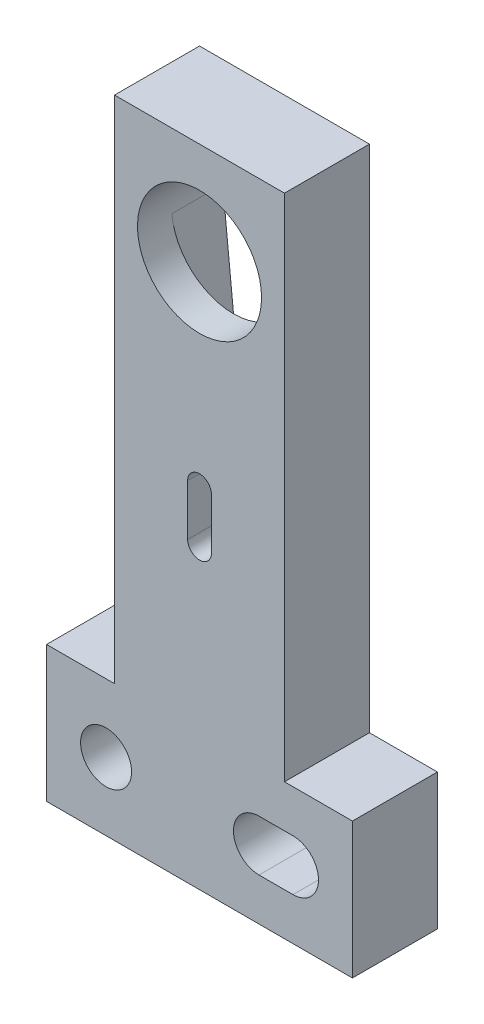
ISO-10303-21;
HEADER;
FILE_DESCRIPTION(('STEP AP214'),'2;1');
FILE_NAME('part.step','',(''),(''),'','','');
FILE_SCHEMA(('AUTOMOTIVE_DESIGN { 1 0 10303 214 1 1 1 1 }'));
ENDSEC;
DATA;
#1=APPLICATION_CONTEXT('core data for automotive mechanical design processes');
#2=APPLICATION_PROTOCOL_DEFINITION('international standard','automotive_design',2000,#1);
#3=PRODUCT_CONTEXT('',#1,'mechanical');
#4=PRODUCT('Part','Part','',(#3));
#5=PRODUCT_RELATED_PRODUCT_CATEGORY('part','',(#4));
#6=PRODUCT_DEFINITION_FORMATION('','',#4);
#7=PRODUCT_DEFINITION_CONTEXT('part definition',#1,'design');
#8=PRODUCT_DEFINITION('design','',#6,#7);
#9=PRODUCT_DEFINITION_SHAPE('','',#8);
#10=(LENGTH_UNIT() NAMED_UNIT(*) SI_UNIT(.MILLI.,.METRE.));
#11=(NAMED_UNIT(*) PLANE_ANGLE_UNIT() SI_UNIT($,.RADIAN.));
#12=(NAMED_UNIT(*) SI_UNIT($,.STERADIAN.) SOLID_ANGLE_UNIT());
#13=UNCERTAINTY_MEASURE_WITH_UNIT(LENGTH_MEASURE(1.E-05),#10,'distance_accuracy_value','');
#14=(GEOMETRIC_REPRESENTATION_CONTEXT(3) GLOBAL_UNCERTAINTY_ASSIGNED_CONTEXT((#13)) GLOBAL_UNIT_ASSIGNED_CONTEXT((#10,
#11,#12)) REPRESENTATION_CONTEXT('',''));
#15=CARTESIAN_POINT('',(0.,0.,0.));
#16=DIRECTION('',(0.,0.,1.));
#17=DIRECTION('',(1.,0.,0.));
#18=AXIS2_PLACEMENT_3D('',#15,#16,#17);
#19=CARTESIAN_POINT('',(0.,-6.,5.));
#20=DIRECTION('',(0.,0.,-1.));
#21=DIRECTION('',(-1.,0.,0.));
#22=AXIS2_PLACEMENT_3D('',#19,#20,#21);
#23=CYLINDRICAL_SURFACE('',#22,3.65);
#24=CARTESIAN_POINT('',(0.,-6.,5.));
#25=DIRECTION('',(0.,0.,1.));
#26=DIRECTION('',(1.,0.,0.));
#27=AXIS2_PLACEMENT_3D('',#24,#25,#26);
#28=CIRCLE('',#27,3.65);
#29=CARTESIAN_POINT('',(3.65,-6.,5.));
#30=VERTEX_POINT('',#29);
#31=EDGE_CURVE('E310',#30,#30,#28,.T.);
#32=ORIENTED_EDGE('',*,*,#31,.T.);
#33=EDGE_LOOP('',(#32));
#34=FACE_BOUND('',#33,.T.);
#35=CARTESIAN_POINT('',(0.,-6.,3.));
#36=DIRECTION('',(0.,0.,1.));
#37=DIRECTION('',(1.,0.,0.));
#38=AXIS2_PLACEMENT_3D('',#35,#36,#37);
#39=CIRCLE('',#38,3.65);
#40=CARTESIAN_POINT('',(-3.63170414543916,-6.365,3.));
#41=VERTEX_POINT('',#40);
#42=CARTESIAN_POINT('',(3.63170414543916,-6.365,3.));
#43=VERTEX_POINT('',#42);
#44=EDGE_CURVE('E596',#41,#43,#39,.T.);
#45=ORIENTED_EDGE('',*,*,#44,.F.);
#46=DIRECTION('',(0.,0.,-1.));
#47=VECTOR('',#46,1.);
#48=CARTESIAN_POINT('',(-3.63170414543916,-6.365,3.));
#49=LINE('',#48,#47);
#50=CARTESIAN_POINT('',(-3.63170414543916,-6.365,0.));
#51=VERTEX_POINT('',#50);
#52=EDGE_CURVE('E593',#41,#51,#49,.T.);
#53=ORIENTED_EDGE('',*,*,#52,.T.);
#54=CARTESIAN_POINT('',(0.,-6.,0.));
#55=DIRECTION('',(0.,0.,1.));
#56=DIRECTION('',(1.,0.,0.));
#57=AXIS2_PLACEMENT_3D('',#54,#55,#56);
#58=CIRCLE('',#57,3.65);
#59=CARTESIAN_POINT('',(3.63170414543916,-6.365,0.));
#60=VERTEX_POINT('',#59);
#61=EDGE_CURVE('E221',#60,#51,#58,.T.);
#62=ORIENTED_EDGE('',*,*,#61,.F.);
#63=DIRECTION('',(0.,0.,-1.));
#64=VECTOR('',#63,1.);
#65=CARTESIAN_POINT('',(3.63170414543916,-6.365,3.));
#66=LINE('',#65,#64);
#67=EDGE_CURVE('E60',#43,#60,#66,.T.);
#68=ORIENTED_EDGE('',*,*,#67,.F.);
#69=EDGE_LOOP('',(#45,#53,#62,#68));
#70=FACE_BOUND('',#69,.T.);
#71=ADVANCED_FACE('F35',(#34,#70),#23,.F.);
#72=CARTESIAN_POINT('',(0.,0.,0.));
#73=DIRECTION('',(0.,0.,1.));
#74=DIRECTION('',(1.,0.,0.));
#75=AXIS2_PLACEMENT_3D('',#72,#73,#74);
#76=PLANE('',#75);
#77=DIRECTION('',(1.,0.,0.));
#78=VECTOR('',#77,1.);
#79=CARTESIAN_POINT('',(0.,0.,0.));
#80=LINE('',#79,#78);
#81=CARTESIAN_POINT('',(-5.,0.,0.));
#82=VERTEX_POINT('',#81);
#83=CARTESIAN_POINT('',(5.,0.,0.));
#84=VERTEX_POINT('',#83);
#85=EDGE_CURVE('E227',#82,#84,#80,.T.);
#86=ORIENTED_EDGE('',*,*,#85,.T.);
#87=DIRECTION('',(0.,-1.,0.));
#88=VECTOR('',#87,1.);
#89=CARTESIAN_POINT('',(5.,0.,0.));
#90=LINE('',#89,#88);
#91=CARTESIAN_POINT('',(5.,-30.,0.));
#92=VERTEX_POINT('',#91);
#93=EDGE_CURVE('E248',#84,#92,#90,.T.);
#94=ORIENTED_EDGE('',*,*,#93,.T.);
#95=DIRECTION('',(-1.,0.,0.));
#96=VECTOR('',#95,1.);
#97=CARTESIAN_POINT('',(0.,-30.,0.));
#98=LINE('',#97,#96);
#99=CARTESIAN_POINT('',(9.,-30.,0.));
#100=VERTEX_POINT('',#99);
#101=EDGE_CURVE('E245',#100,#92,#98,.T.);
#102=ORIENTED_EDGE('',*,*,#101,.F.);
#103=DIRECTION('',(0.,1.,0.));
#104=VECTOR('',#103,1.);
#105=CARTESIAN_POINT('',(9.00000000000001,0.,0.));
#106=LINE('',#105,#104);
#107=CARTESIAN_POINT('',(9.,-38.,0.));
#108=VERTEX_POINT('',#107);
#109=EDGE_CURVE('E242',#108,#100,#106,.T.);
#110=ORIENTED_EDGE('',*,*,#109,.F.);
#111=DIRECTION('',(1.,0.,0.));
#112=VECTOR('',#111,1.);
#113=CARTESIAN_POINT('',(0.,-38.,0.));
#114=LINE('',#113,#112);
#115=CARTESIAN_POINT('',(-9.,-38.,0.));
#116=VERTEX_POINT('',#115);
#117=EDGE_CURVE('E239',#116,#108,#114,.T.);
#118=ORIENTED_EDGE('',*,*,#117,.F.);
#119=DIRECTION('',(0.,-1.,0.));
#120=VECTOR('',#119,1.);
#121=CARTESIAN_POINT('',(-9.,0.,0.));
#122=LINE('',#121,#120);
#123=CARTESIAN_POINT('',(-9.,-30.,0.));
#124=VERTEX_POINT('',#123);
#125=EDGE_CURVE('E236',#124,#116,#122,.T.);
#126=ORIENTED_EDGE('',*,*,#125,.F.);
#127=DIRECTION('',(-1.,0.,0.));
#128=VECTOR('',#127,1.);
#129=CARTESIAN_POINT('',(0.,-30.,0.));
#130=LINE('',#129,#128);
#131=CARTESIAN_POINT('',(-5.,-30.,0.));
#132=VERTEX_POINT('',#131);
#133=EDGE_CURVE('E233',#132,#124,#130,.T.);
#134=ORIENTED_EDGE('',*,*,#133,.F.);
#135=DIRECTION('',(0.,-1.,0.));
#136=VECTOR('',#135,1.);
#137=CARTESIAN_POINT('',(-5.,0.,0.));
#138=LINE('',#137,#136);
#139=EDGE_CURVE('E230',#82,#132,#138,.T.);
#140=ORIENTED_EDGE('',*,*,#139,.F.);
#141=EDGE_LOOP('',(#86,#94,#102,#110,#118,#126,#134,#140));
#142=FACE_BOUND('',#141,.T.);
#143=CARTESIAN_POINT('',(-5.50000000000001,-34.,0.));
#144=DIRECTION('',(0.,0.,1.));
#145=DIRECTION('',(1.,0.,0.));
#146=AXIS2_PLACEMENT_3D('',#143,#144,#145);
#147=CIRCLE('',#146,1.5);
#148=CARTESIAN_POINT('',(-4.,-34.,0.));
#149=VERTEX_POINT('',#148);
#150=EDGE_CURVE('E224',#149,#149,#147,.T.);
#151=ORIENTED_EDGE('',*,*,#150,.T.);
#152=EDGE_LOOP('',(#151));
#153=FACE_BOUND('',#152,.T.);
#154=CARTESIAN_POINT('',(3.49999999999999,-34.,0.));
#155=DIRECTION('',(0.,0.,1.));
#156=DIRECTION('',(1.,0.,0.));
#157=AXIS2_PLACEMENT_3D('',#154,#155,#156);
#158=CIRCLE('',#157,1.5);
#159=CARTESIAN_POINT('',(3.49999999999999,-32.5,0.));
#160=VERTEX_POINT('',#159);
#161=CARTESIAN_POINT('',(3.49999999999999,-35.5,0.));
#162=VERTEX_POINT('',#161);
#163=EDGE_CURVE('E208',#160,#162,#158,.T.);
#164=ORIENTED_EDGE('',*,*,#163,.T.);
#165=DIRECTION('',(1.,0.,0.));
#166=VECTOR('',#165,1.);
#167=CARTESIAN_POINT('',(0.,-35.5,0.));
#168=LINE('',#167,#166);
#169=CARTESIAN_POINT('',(5.49999999999999,-35.5,0.));
#170=VERTEX_POINT('',#169);
#171=EDGE_CURVE('E218',#162,#170,#168,.T.);
#172=ORIENTED_EDGE('',*,*,#171,.T.);
#173=CARTESIAN_POINT('',(5.49999999999999,-34.,0.));
#174=DIRECTION('',(0.,0.,1.));
#175=DIRECTION('',(1.,0.,0.));
#176=AXIS2_PLACEMENT_3D('',#173,#174,#175);
#177=CIRCLE('',#176,1.5);
#178=CARTESIAN_POINT('',(5.49999999999999,-32.5,0.));
#179=VERTEX_POINT('',#178);
#180=EDGE_CURVE('E215',#170,#179,#177,.T.);
#181=ORIENTED_EDGE('',*,*,#180,.T.);
#182=DIRECTION('',(-1.,0.,0.));
#183=VECTOR('',#182,1.);
#184=CARTESIAN_POINT('',(0.,-32.5,0.));
#185=LINE('',#184,#183);
#186=EDGE_CURVE('E211',#179,#160,#185,.T.);
#187=ORIENTED_EDGE('',*,*,#186,.T.);
#188=EDGE_LOOP('',(#164,#172,#181,#187));
#189=FACE_BOUND('',#188,.T.);
#190=DIRECTION('',(0.1,-0.99498743710662,0.));
#191=VECTOR('',#190,1.);
#192=CARTESIAN_POINT('',(-4.22869660770314,-0.425000000000001,0.));
#193=LINE('',#192,#191);
#194=CARTESIAN_POINT('',(-2.23872173348989,-20.225,0.));
#195=VERTEX_POINT('',#194);
#196=EDGE_CURVE('E586',#51,#195,#193,.T.);
#197=ORIENTED_EDGE('',*,*,#196,.T.);
#198=CARTESIAN_POINT('',(0.,-20.,0.));
#199=DIRECTION('',(0.,0.,1.));
#200=DIRECTION('',(1.,0.,0.));
#201=AXIS2_PLACEMENT_3D('',#198,#199,#200);
#202=CIRCLE('',#201,2.25);
#203=CARTESIAN_POINT('',(2.2387217334899,-20.225,0.));
#204=VERTEX_POINT('',#203);
#205=EDGE_CURVE('E583',#195,#204,#202,.T.);
#206=ORIENTED_EDGE('',*,*,#205,.T.);
#207=DIRECTION('',(0.1,0.99498743710662,0.));
#208=VECTOR('',#207,1.);
#209=CARTESIAN_POINT('',(4.22869660770314,-0.425,0.));
#210=LINE('',#209,#208);
#211=EDGE_CURVE('E188',#204,#60,#210,.T.);
#212=ORIENTED_EDGE('',*,*,#211,.T.);
#213=ORIENTED_EDGE('',*,*,#61,.T.);
#214=EDGE_LOOP('',(#197,#206,#212,#213));
#215=FACE_BOUND('',#214,.T.);
#216=ADVANCED_FACE('F296',(#142,#153,#189,#215),#76,.F.);
#217=CARTESIAN_POINT('',(0.,-17.5,5.));
#218=DIRECTION('',(0.,0.,-1.));
#219=DIRECTION('',(-1.,0.,0.));
#220=AXIS2_PLACEMENT_3D('',#217,#218,#219);
#221=CYLINDRICAL_SURFACE('',#220,0.7);
#222=CARTESIAN_POINT('',(0.,-17.5,3.));
#223=DIRECTION('',(0.,0.,1.));
#224=DIRECTION('',(1.,0.,0.));
#225=AXIS2_PLACEMENT_3D('',#222,#223,#224);
#226=CIRCLE('',#225,0.7);
#227=CARTESIAN_POINT('',(0.700000000000002,-17.5,3.));
#228=VERTEX_POINT('',#227);
#229=CARTESIAN_POINT('',(-0.699999999999998,-17.5,3.));
#230=VERTEX_POINT('',#229);
#231=EDGE_CURVE('E52',#228,#230,#226,.T.);
#232=ORIENTED_EDGE('',*,*,#231,.F.);
#233=DIRECTION('',(0.,0.,-1.));
#234=VECTOR('',#233,1.);
#235=CARTESIAN_POINT('',(0.700000000000002,-17.5,5.));
#236=LINE('',#235,#234);
#237=CARTESIAN_POINT('',(0.700000000000002,-17.5,5.));
#238=VERTEX_POINT('',#237);
#239=EDGE_CURVE('E11',#238,#228,#236,.T.);
#240=ORIENTED_EDGE('',*,*,#239,.F.);
#241=CARTESIAN_POINT('',(0.,-17.5,5.));
#242=DIRECTION('',(0.,0.,1.));
#243=DIRECTION('',(1.,0.,0.));
#244=AXIS2_PLACEMENT_3D('',#241,#242,#243);
#245=CIRCLE('',#244,0.7);
#246=CARTESIAN_POINT('',(-0.699999999999998,-17.5,5.));
#247=VERTEX_POINT('',#246);
#248=EDGE_CURVE('E198',#238,#247,#245,.T.);
#249=ORIENTED_EDGE('',*,*,#248,.T.);
#250=DIRECTION('',(0.,0.,-1.));
#251=VECTOR('',#250,1.);
#252=CARTESIAN_POINT('',(-0.699999999999998,-17.5,5.));
#253=LINE('',#252,#251);
#254=EDGE_CURVE('E187',#247,#230,#253,.T.);
#255=ORIENTED_EDGE('',*,*,#254,.T.);
#256=EDGE_LOOP('',(#232,#240,#249,#255));
#257=FACE_BOUND('',#256,.T.);
#258=ADVANCED_FACE('F183',(#257),#221,.F.);
#259=CARTESIAN_POINT('',(0.699999999999999,0.,5.));
#260=DIRECTION('',(-1.,0.,0.));
#261=DIRECTION('',(0.,-1.,0.));
#262=AXIS2_PLACEMENT_3D('',#259,#260,#261);
#263=PLANE('',#262);
#264=DIRECTION('',(0.,1.,0.));
#265=VECTOR('',#264,1.);
#266=CARTESIAN_POINT('',(0.699999999999999,0.,3.));
#267=LINE('',#266,#265);
#268=CARTESIAN_POINT('',(0.700000000000002,-20.5,3.));
#269=VERTEX_POINT('',#268);
#270=EDGE_CURVE('E173',#269,#228,#267,.T.);
#271=ORIENTED_EDGE('',*,*,#270,.F.);
#272=DIRECTION('',(0.,0.,-1.));
#273=VECTOR('',#272,1.);
#274=CARTESIAN_POINT('',(0.700000000000002,-20.5,5.));
#275=LINE('',#274,#273);
#276=CARTESIAN_POINT('',(0.700000000000002,-20.5,5.));
#277=VERTEX_POINT('',#276);
#278=EDGE_CURVE('E44',#277,#269,#275,.T.);
#279=ORIENTED_EDGE('',*,*,#278,.F.);
#280=DIRECTION('',(0.,1.,0.));
#281=VECTOR('',#280,1.);
#282=CARTESIAN_POINT('',(0.699999999999999,0.,5.));
#283=LINE('',#282,#281);
#284=EDGE_CURVE('E193',#277,#238,#283,.T.);
#285=ORIENTED_EDGE('',*,*,#284,.T.);
#286=ORIENTED_EDGE('',*,*,#239,.T.);
#287=EDGE_LOOP('',(#271,#279,#285,#286));
#288=FACE_BOUND('',#287,.T.);
#289=ADVANCED_FACE('F191',(#288),#263,.T.);
#290=CARTESIAN_POINT('',(0.,-20.5,5.));
#291=DIRECTION('',(0.,0.,-1.));
#292=DIRECTION('',(-1.,0.,0.));
#293=AXIS2_PLACEMENT_3D('',#290,#291,#292);
#294=CYLINDRICAL_SURFACE('',#293,0.7);
#295=CARTESIAN_POINT('',(0.,-20.5,3.));
#296=DIRECTION('',(0.,0.,1.));
#297=DIRECTION('',(1.,0.,0.));
#298=AXIS2_PLACEMENT_3D('',#295,#296,#297);
#299=CIRCLE('',#298,0.7);
#300=CARTESIAN_POINT('',(-0.699999999999997,-20.5,3.));
#301=VERTEX_POINT('',#300);
#302=EDGE_CURVE('E177',#301,#269,#299,.T.);
#303=ORIENTED_EDGE('',*,*,#302,.F.);
#304=DIRECTION('',(0.,0.,-1.));
#305=VECTOR('',#304,1.);
#306=CARTESIAN_POINT('',(-0.699999999999997,-20.5,5.));
#307=LINE('',#306,#305);
#308=CARTESIAN_POINT('',(-0.699999999999997,-20.5,5.));
#309=VERTEX_POINT('',#308);
#310=EDGE_CURVE('E253',#309,#301,#307,.T.);
#311=ORIENTED_EDGE('',*,*,#310,.F.);
#312=CARTESIAN_POINT('',(0.,-20.5,5.));
#313=DIRECTION('',(0.,0.,1.));
#314=DIRECTION('',(1.,0.,0.));
#315=AXIS2_PLACEMENT_3D('',#312,#313,#314);
#316=CIRCLE('',#315,0.7);
#317=EDGE_CURVE('E197',#309,#277,#316,.T.);
#318=ORIENTED_EDGE('',*,*,#317,.T.);
#319=ORIENTED_EDGE('',*,*,#278,.T.);
#320=EDGE_LOOP('',(#303,#311,#318,#319));
#321=FACE_BOUND('',#320,.T.);
#322=ADVANCED_FACE('F446',(#321),#294,.F.);
#323=CARTESIAN_POINT('',(0.,0.,5.));
#324=DIRECTION('',(0.,1.,0.));
#325=DIRECTION('',(-1.,0.,0.));
#326=AXIS2_PLACEMENT_3D('',#323,#324,#325);
#327=PLANE('',#326);
#328=ORIENTED_EDGE('',*,*,#85,.F.);
#329=DIRECTION('',(0.,0.,-1.));
#330=VECTOR('',#329,1.);
#331=CARTESIAN_POINT('',(-5.,0.,5.));
#332=LINE('',#331,#330);
#333=CARTESIAN_POINT('',(-5.,0.,5.));
#334=VERTEX_POINT('',#333);
#335=EDGE_CURVE('E254',#334,#82,#332,.T.);
#336=ORIENTED_EDGE('',*,*,#335,.F.);
#337=DIRECTION('',(1.,0.,0.));
#338=VECTOR('',#337,1.);
#339=CARTESIAN_POINT('',(0.,0.,5.));
#340=LINE('',#339,#338);
#341=CARTESIAN_POINT('',(5.,0.,5.));
#342=VERTEX_POINT('',#341);
#343=EDGE_CURVE('E319',#334,#342,#340,.T.);
#344=ORIENTED_EDGE('',*,*,#343,.T.);
#345=DIRECTION('',(0.,0.,-1.));
#346=VECTOR('',#345,1.);
#347=CARTESIAN_POINT('',(5.,0.,5.));
#348=LINE('',#347,#346);
#349=EDGE_CURVE('E258',#342,#84,#348,.T.);
#350=ORIENTED_EDGE('',*,*,#349,.T.);
#351=EDGE_LOOP('',(#328,#336,#344,#350));
#352=FACE_BOUND('',#351,.T.);
#353=ADVANCED_FACE('F354',(#352),#327,.T.);
#354=CARTESIAN_POINT('',(-5.,0.,5.));
#355=DIRECTION('',(1.,0.,0.));
#356=DIRECTION('',(0.,1.,0.));
#357=AXIS2_PLACEMENT_3D('',#354,#355,#356);
#358=PLANE('',#357);
#359=ORIENTED_EDGE('',*,*,#139,.T.);
#360=DIRECTION('',(0.,0.,-1.));
#361=VECTOR('',#360,1.);
#362=CARTESIAN_POINT('',(-5.,-30.,5.));
#363=LINE('',#362,#361);
#364=CARTESIAN_POINT('',(-5.,-30.,5.));
#365=VERTEX_POINT('',#364);
#366=EDGE_CURVE('E274',#365,#132,#363,.T.);
#367=ORIENTED_EDGE('',*,*,#366,.F.);
#368=DIRECTION('',(0.,-1.,0.));
#369=VECTOR('',#368,1.);
#370=CARTESIAN_POINT('',(-5.,0.,5.));
#371=LINE('',#370,#369);
#372=EDGE_CURVE('E322',#334,#365,#371,.T.);
#373=ORIENTED_EDGE('',*,*,#372,.F.);
#374=ORIENTED_EDGE('',*,*,#335,.T.);
#375=EDGE_LOOP('',(#359,#367,#373,#374));
#376=FACE_BOUND('',#375,.T.);
#377=ADVANCED_FACE('F358',(#376),#358,.F.);
#378=CARTESIAN_POINT('',(0.,-30.,5.));
#379=DIRECTION('',(0.,-1.,0.));
#380=DIRECTION('',(0.,0.,-1.));
#381=AXIS2_PLACEMENT_3D('',#378,#379,#380);
#382=PLANE('',#381);
#383=ORIENTED_EDGE('',*,*,#133,.T.);
#384=DIRECTION('',(0.,0.,-1.));
#385=VECTOR('',#384,1.);
#386=CARTESIAN_POINT('',(-9.,-30.,5.));
#387=LINE('',#386,#385);
#388=CARTESIAN_POINT('',(-9.,-30.,5.));
#389=VERTEX_POINT('',#388);
#390=EDGE_CURVE('E271',#389,#124,#387,.T.);
#391=ORIENTED_EDGE('',*,*,#390,.F.);
#392=DIRECTION('',(-1.,0.,0.));
#393=VECTOR('',#392,1.);
#394=CARTESIAN_POINT('',(0.,-30.,5.));
#395=LINE('',#394,#393);
#396=EDGE_CURVE('E325',#365,#389,#395,.T.);
#397=ORIENTED_EDGE('',*,*,#396,.F.);
#398=ORIENTED_EDGE('',*,*,#366,.T.);
#399=EDGE_LOOP('',(#383,#391,#397,#398));
#400=FACE_BOUND('',#399,.T.);
#401=ADVANCED_FACE('F362',(#400),#382,.F.);
#402=CARTESIAN_POINT('',(-9.,0.,5.));
#403=DIRECTION('',(1.,0.,0.));
#404=DIRECTION('',(0.,0.,-1.));
#405=AXIS2_PLACEMENT_3D('',#402,#403,#404);
#406=PLANE('',#405);
#407=ORIENTED_EDGE('',*,*,#125,.T.);
#408=DIRECTION('',(0.,0.,-1.));
#409=VECTOR('',#408,1.);
#410=CARTESIAN_POINT('',(-9.,-38.,5.));
#411=LINE('',#410,#409);
#412=CARTESIAN_POINT('',(-9.,-38.,5.));
#413=VERTEX_POINT('',#412);
#414=EDGE_CURVE('E268',#413,#116,#411,.T.);
#415=ORIENTED_EDGE('',*,*,#414,.F.);
#416=DIRECTION('',(0.,-1.,0.));
#417=VECTOR('',#416,1.);
#418=CARTESIAN_POINT('',(-9.,0.,5.));
#419=LINE('',#418,#417);
#420=EDGE_CURVE('E328',#389,#413,#419,.T.);
#421=ORIENTED_EDGE('',*,*,#420,.F.);
#422=ORIENTED_EDGE('',*,*,#390,.T.);
#423=EDGE_LOOP('',(#407,#415,#421,#422));
#424=FACE_BOUND('',#423,.T.);
#425=ADVANCED_FACE('F364',(#424),#406,.F.);
#426=CARTESIAN_POINT('',(0.,-38.,5.));
#427=DIRECTION('',(0.,1.,0.));
#428=DIRECTION('',(0.,0.,1.));
#429=AXIS2_PLACEMENT_3D('',#426,#427,#428);
#430=PLANE('',#429);
#431=ORIENTED_EDGE('',*,*,#117,.T.);
#432=DIRECTION('',(0.,0.,-1.));
#433=VECTOR('',#432,1.);
#434=CARTESIAN_POINT('',(9.,-38.,5.));
#435=LINE('',#434,#433);
#436=CARTESIAN_POINT('',(9.,-38.,5.));
#437=VERTEX_POINT('',#436);
#438=EDGE_CURVE('E265',#437,#108,#435,.T.);
#439=ORIENTED_EDGE('',*,*,#438,.F.);
#440=DIRECTION('',(1.,0.,0.));
#441=VECTOR('',#440,1.);
#442=CARTESIAN_POINT('',(0.,-38.,5.));
#443=LINE('',#442,#441);
#444=EDGE_CURVE('E331',#413,#437,#443,.T.);
#445=ORIENTED_EDGE('',*,*,#444,.F.);
#446=ORIENTED_EDGE('',*,*,#414,.T.);
#447=EDGE_LOOP('',(#431,#439,#445,#446));
#448=FACE_BOUND('',#447,.T.);
#449=ADVANCED_FACE('F366',(#448),#430,.F.);
#450=CARTESIAN_POINT('',(9.00000000000001,0.,5.));
#451=DIRECTION('',(-1.,0.,0.));
#452=DIRECTION('',(0.,-1.,0.));
#453=AXIS2_PLACEMENT_3D('',#450,#451,#452);
#454=PLANE('',#453);
#455=ORIENTED_EDGE('',*,*,#109,.T.);
#456=DIRECTION('',(0.,0.,-1.));
#457=VECTOR('',#456,1.);
#458=CARTESIAN_POINT('',(9.,-30.,5.));
#459=LINE('',#458,#457);
#460=CARTESIAN_POINT('',(9.,-30.,5.));
#461=VERTEX_POINT('',#460);
#462=EDGE_CURVE('E262',#461,#100,#459,.T.);
#463=ORIENTED_EDGE('',*,*,#462,.F.);
#464=DIRECTION('',(0.,1.,0.));
#465=VECTOR('',#464,1.);
#466=CARTESIAN_POINT('',(9.00000000000001,0.,5.));
#467=LINE('',#466,#465);
#468=EDGE_CURVE('E334',#437,#461,#467,.T.);
#469=ORIENTED_EDGE('',*,*,#468,.F.);
#470=ORIENTED_EDGE('',*,*,#438,.T.);
#471=EDGE_LOOP('',(#455,#463,#469,#470));
#472=FACE_BOUND('',#471,.T.);
#473=ADVANCED_FACE('F369',(#472),#454,.F.);
#474=CARTESIAN_POINT('',(0.,-30.,5.));
#475=DIRECTION('',(0.,-1.,0.));
#476=DIRECTION('',(0.,0.,-1.));
#477=AXIS2_PLACEMENT_3D('',#474,#475,#476);
#478=PLANE('',#477);
#479=ORIENTED_EDGE('',*,*,#101,.T.);
#480=DIRECTION('',(0.,0.,-1.));
#481=VECTOR('',#480,1.);
#482=CARTESIAN_POINT('',(5.,-30.,5.));
#483=LINE('',#482,#481);
#484=CARTESIAN_POINT('',(5.,-30.,5.));
#485=VERTEX_POINT('',#484);
#486=EDGE_CURVE('E260',#485,#92,#483,.T.);
#487=ORIENTED_EDGE('',*,*,#486,.F.);
#488=DIRECTION('',(-1.,0.,0.));
#489=VECTOR('',#488,1.);
#490=CARTESIAN_POINT('',(0.,-30.,5.));
#491=LINE('',#490,#489);
#492=EDGE_CURVE('E337',#461,#485,#491,.T.);
#493=ORIENTED_EDGE('',*,*,#492,.F.);
#494=ORIENTED_EDGE('',*,*,#462,.T.);
#495=EDGE_LOOP('',(#479,#487,#493,#494));
#496=FACE_BOUND('',#495,.T.);
#497=ADVANCED_FACE('F348',(#496),#478,.F.);
#498=CARTESIAN_POINT('',(3.49999999999999,-34.,5.));
#499=DIRECTION('',(0.,0.,-1.));
#500=DIRECTION('',(-1.,0.,0.));
#501=AXIS2_PLACEMENT_3D('',#498,#499,#500);
#502=CYLINDRICAL_SURFACE('',#501,1.5);
#503=ORIENTED_EDGE('',*,*,#163,.F.);
#504=DIRECTION('',(0.,0.,-1.));
#505=VECTOR('',#504,1.);
#506=CARTESIAN_POINT('',(3.49999999999999,-32.5,5.));
#507=LINE('',#506,#505);
#508=CARTESIAN_POINT('',(3.49999999999999,-32.5,5.));
#509=VERTEX_POINT('',#508);
#510=EDGE_CURVE('E39',#509,#160,#507,.T.);
#511=ORIENTED_EDGE('',*,*,#510,.F.);
#512=CARTESIAN_POINT('',(3.49999999999999,-34.,5.));
#513=DIRECTION('',(0.,0.,1.));
#514=DIRECTION('',(1.,0.,0.));
#515=AXIS2_PLACEMENT_3D('',#512,#513,#514);
#516=CIRCLE('',#515,1.5);
#517=CARTESIAN_POINT('',(3.49999999999999,-35.5,5.));
#518=VERTEX_POINT('',#517);
#519=EDGE_CURVE('E251',#509,#518,#516,.T.);
#520=ORIENTED_EDGE('',*,*,#519,.T.);
#521=DIRECTION('',(0.,0.,-1.));
#522=VECTOR('',#521,1.);
#523=CARTESIAN_POINT('',(3.49999999999999,-35.5,5.));
#524=LINE('',#523,#522);
#525=EDGE_CURVE('E207',#518,#162,#524,.T.);
#526=ORIENTED_EDGE('',*,*,#525,.T.);
#527=EDGE_LOOP('',(#503,#511,#520,#526));
#528=FACE_BOUND('',#527,.T.);
#529=ADVANCED_FACE('F37',(#528),#502,.F.);
#530=CARTESIAN_POINT('',(0.,-32.5,5.));
#531=DIRECTION('',(0.,-1.,0.));
#532=DIRECTION('',(0.,0.,-1.));
#533=AXIS2_PLACEMENT_3D('',#530,#531,#532);
#534=PLANE('',#533);
#535=ORIENTED_EDGE('',*,*,#186,.F.);
#536=DIRECTION('',(0.,0.,-1.));
#537=VECTOR('',#536,1.);
#538=CARTESIAN_POINT('',(5.49999999999999,-32.5,5.));
#539=LINE('',#538,#537);
#540=CARTESIAN_POINT('',(5.49999999999999,-32.5,5.));
#541=VERTEX_POINT('',#540);
#542=EDGE_CURVE('E280',#541,#179,#539,.T.);
#543=ORIENTED_EDGE('',*,*,#542,.F.);
#544=DIRECTION('',(-1.,0.,0.));
#545=VECTOR('',#544,1.);
#546=CARTESIAN_POINT('',(0.,-32.5,5.));
#547=LINE('',#546,#545);
#548=EDGE_CURVE('E290',#541,#509,#547,.T.);
#549=ORIENTED_EDGE('',*,*,#548,.T.);
#550=ORIENTED_EDGE('',*,*,#510,.T.);
#551=EDGE_LOOP('',(#535,#543,#549,#550));
#552=FACE_BOUND('',#551,.T.);
#553=ADVANCED_FACE('F288',(#552),#534,.T.);
#554=CARTESIAN_POINT('',(5.49999999999999,-34.,5.));
#555=DIRECTION('',(0.,0.,-1.));
#556=DIRECTION('',(-1.,0.,0.));
#557=AXIS2_PLACEMENT_3D('',#554,#555,#556);
#558=CYLINDRICAL_SURFACE('',#557,1.5);
#559=ORIENTED_EDGE('',*,*,#180,.F.);
#560=DIRECTION('',(0.,0.,-1.));
#561=VECTOR('',#560,1.);
#562=CARTESIAN_POINT('',(5.49999999999999,-35.5,5.));
#563=LINE('',#562,#561);
#564=CARTESIAN_POINT('',(5.49999999999999,-35.5,5.));
#565=VERTEX_POINT('',#564);
#566=EDGE_CURVE('E279',#565,#170,#563,.T.);
#567=ORIENTED_EDGE('',*,*,#566,.F.);
#568=CARTESIAN_POINT('',(5.49999999999999,-34.,5.));
#569=DIRECTION('',(0.,0.,1.));
#570=DIRECTION('',(1.,0.,0.));
#571=AXIS2_PLACEMENT_3D('',#568,#569,#570);
#572=CIRCLE('',#571,1.5);
#573=EDGE_CURVE('E300',#565,#541,#572,.T.);
#574=ORIENTED_EDGE('',*,*,#573,.T.);
#575=ORIENTED_EDGE('',*,*,#542,.T.);
#576=EDGE_LOOP('',(#559,#567,#574,#575));
#577=FACE_BOUND('',#576,.T.);
#578=ADVANCED_FACE('F298',(#577),#558,.F.);
#579=CARTESIAN_POINT('',(5.,0.,5.));
#580=DIRECTION('',(1.,0.,0.));
#581=DIRECTION('',(0.,1.,0.));
#582=AXIS2_PLACEMENT_3D('',#579,#580,#581);
#583=PLANE('',#582);
#584=ORIENTED_EDGE('',*,*,#93,.F.);
#585=ORIENTED_EDGE('',*,*,#349,.F.);
#586=DIRECTION('',(0.,-1.,0.));
#587=VECTOR('',#586,1.);
#588=CARTESIAN_POINT('',(5.,0.,5.));
#589=LINE('',#588,#587);
#590=EDGE_CURVE('E202',#342,#485,#589,.T.);
#591=ORIENTED_EDGE('',*,*,#590,.T.);
#592=ORIENTED_EDGE('',*,*,#486,.T.);
#593=EDGE_LOOP('',(#584,#585,#591,#592));
#594=FACE_BOUND('',#593,.T.);
#595=ADVANCED_FACE('F342',(#594),#583,.T.);
#596=CARTESIAN_POINT('',(-5.50000000000001,-34.,5.));
#597=DIRECTION('',(0.,0.,-1.));
#598=DIRECTION('',(-1.,0.,0.));
#599=AXIS2_PLACEMENT_3D('',#596,#597,#598);
#600=CYLINDRICAL_SURFACE('',#599,1.5);
#601=CARTESIAN_POINT('',(-5.50000000000001,-34.,5.));
#602=DIRECTION('',(0.,0.,1.));
#603=DIRECTION('',(1.,0.,0.));
#604=AXIS2_PLACEMENT_3D('',#601,#602,#603);
#605=CIRCLE('',#604,1.5);
#606=CARTESIAN_POINT('',(-4.,-34.,5.));
#607=VERTEX_POINT('',#606);
#608=EDGE_CURVE('E313',#607,#607,#605,.T.);
#609=ORIENTED_EDGE('',*,*,#608,.T.);
#610=EDGE_LOOP('',(#609));
#611=FACE_BOUND('',#610,.T.);
#612=ORIENTED_EDGE('',*,*,#150,.F.);
#613=EDGE_LOOP('',(#612));
#614=FACE_BOUND('',#613,.T.);
#615=ADVANCED_FACE('F388',(#611,#614),#600,.F.);
#616=CARTESIAN_POINT('',(0.,-35.5,5.));
#617=DIRECTION('',(0.,1.,0.));
#618=DIRECTION('',(0.,0.,1.));
#619=AXIS2_PLACEMENT_3D('',#616,#617,#618);
#620=PLANE('',#619);
#621=ORIENTED_EDGE('',*,*,#171,.F.);
#622=ORIENTED_EDGE('',*,*,#525,.F.);
#623=DIRECTION('',(1.,0.,0.));
#624=VECTOR('',#623,1.);
#625=CARTESIAN_POINT('',(0.,-35.5,5.));
#626=LINE('',#625,#624);
#627=EDGE_CURVE('E307',#518,#565,#626,.T.);
#628=ORIENTED_EDGE('',*,*,#627,.T.);
#629=ORIENTED_EDGE('',*,*,#566,.T.);
#630=EDGE_LOOP('',(#621,#622,#628,#629));
#631=FACE_BOUND('',#630,.T.);
#632=ADVANCED_FACE('F309',(#631),#620,.T.);
#633=CARTESIAN_POINT('',(-0.700000000000003,0.,5.));
#634=DIRECTION('',(-1.,0.,0.));
#635=DIRECTION('',(0.,-1.,0.));
#636=AXIS2_PLACEMENT_3D('',#633,#634,#635);
#637=PLANE('',#636);
#638=ORIENTED_EDGE('',*,*,#310,.T.);
#639=DIRECTION('',(0.,1.,0.));
#640=VECTOR('',#639,1.);
#641=CARTESIAN_POINT('',(-0.700000000000003,0.,3.));
#642=LINE('',#641,#640);
#643=EDGE_CURVE('E607',#301,#230,#642,.T.);
#644=ORIENTED_EDGE('',*,*,#643,.T.);
#645=ORIENTED_EDGE('',*,*,#254,.F.);
#646=DIRECTION('',(0.,1.,0.));
#647=VECTOR('',#646,1.);
#648=CARTESIAN_POINT('',(-0.700000000000003,0.,5.));
#649=LINE('',#648,#647);
#650=EDGE_CURVE('E200',#309,#247,#649,.T.);
#651=ORIENTED_EDGE('',*,*,#650,.F.);
#652=EDGE_LOOP('',(#638,#644,#645,#651));
#653=FACE_BOUND('',#652,.T.);
#654=ADVANCED_FACE('F392',(#653),#637,.F.);
#655=CARTESIAN_POINT('',(0.,0.,5.));
#656=DIRECTION('',(0.,0.,1.));
#657=DIRECTION('',(1.,0.,0.));
#658=AXIS2_PLACEMENT_3D('',#655,#656,#657);
#659=PLANE('',#658);
#660=ORIENTED_EDGE('',*,*,#519,.F.);
#661=ORIENTED_EDGE('',*,*,#548,.F.);
#662=ORIENTED_EDGE('',*,*,#573,.F.);
#663=ORIENTED_EDGE('',*,*,#627,.F.);
#664=EDGE_LOOP('',(#660,#661,#662,#663));
#665=FACE_BOUND('',#664,.T.);
#666=ORIENTED_EDGE('',*,*,#31,.F.);
#667=EDGE_LOOP('',(#666));
#668=FACE_BOUND('',#667,.T.);
#669=ORIENTED_EDGE('',*,*,#608,.F.);
#670=EDGE_LOOP('',(#669));
#671=FACE_BOUND('',#670,.T.);
#672=ORIENTED_EDGE('',*,*,#343,.F.);
#673=ORIENTED_EDGE('',*,*,#372,.T.);
#674=ORIENTED_EDGE('',*,*,#396,.T.);
#675=ORIENTED_EDGE('',*,*,#420,.T.);
#676=ORIENTED_EDGE('',*,*,#444,.T.);
#677=ORIENTED_EDGE('',*,*,#468,.T.);
#678=ORIENTED_EDGE('',*,*,#492,.T.);
#679=ORIENTED_EDGE('',*,*,#590,.F.);
#680=EDGE_LOOP('',(#672,#673,#674,#675,#676,#677,#678,#679));
#681=FACE_BOUND('',#680,.T.);
#682=ORIENTED_EDGE('',*,*,#248,.F.);
#683=ORIENTED_EDGE('',*,*,#284,.F.);
#684=ORIENTED_EDGE('',*,*,#317,.F.);
#685=ORIENTED_EDGE('',*,*,#650,.T.);
#686=EDGE_LOOP('',(#682,#683,#684,#685));
#687=FACE_BOUND('',#686,.T.);
#688=ADVANCED_FACE('F305',(#665,#668,#671,#681,#687),#659,.T.);
#689=CARTESIAN_POINT('',(-4.22869660770314,-0.425000000000001,3.));
#690=DIRECTION('',(0.99498743710662,0.1,0.));
#691=DIRECTION('',(-0.1,0.99498743710662,0.));
#692=AXIS2_PLACEMENT_3D('',#689,#690,#691);
#693=PLANE('',#692);
#694=ORIENTED_EDGE('',*,*,#196,.F.);
#695=ORIENTED_EDGE('',*,*,#52,.F.);
#696=DIRECTION('',(0.1,-0.99498743710662,0.));
#697=VECTOR('',#696,1.);
#698=CARTESIAN_POINT('',(-4.22869660770314,-0.425000000000001,3.));
#699=LINE('',#698,#697);
#700=CARTESIAN_POINT('',(-2.23872173348989,-20.225,3.));
#701=VERTEX_POINT('',#700);
#702=EDGE_CURVE('E602',#41,#701,#699,.T.);
#703=ORIENTED_EDGE('',*,*,#702,.T.);
#704=DIRECTION('',(0.,0.,-1.));
#705=VECTOR('',#704,1.);
#706=CARTESIAN_POINT('',(-2.23872173348989,-20.225,3.));
#707=LINE('',#706,#705);
#708=EDGE_CURVE('E212',#701,#195,#707,.T.);
#709=ORIENTED_EDGE('',*,*,#708,.T.);
#710=EDGE_LOOP('',(#694,#695,#703,#709));
#711=FACE_BOUND('',#710,.T.);
#712=ADVANCED_FACE('F487',(#711),#693,.T.);
#713=CARTESIAN_POINT('',(0.,-20.,3.));
#714=DIRECTION('',(0.,0.,-1.));
#715=DIRECTION('',(-1.,0.,0.));
#716=AXIS2_PLACEMENT_3D('',#713,#714,#715);
#717=CYLINDRICAL_SURFACE('',#716,2.25);
#718=ORIENTED_EDGE('',*,*,#205,.F.);
#719=ORIENTED_EDGE('',*,*,#708,.F.);
#720=CARTESIAN_POINT('',(0.,-20.,3.));
#721=DIRECTION('',(0.,0.,1.));
#722=DIRECTION('',(1.,0.,0.));
#723=AXIS2_PLACEMENT_3D('',#720,#721,#722);
#724=CIRCLE('',#723,2.25);
#725=CARTESIAN_POINT('',(2.2387217334899,-20.225,3.));
#726=VERTEX_POINT('',#725);
#727=EDGE_CURVE('E603',#701,#726,#724,.T.);
#728=ORIENTED_EDGE('',*,*,#727,.T.);
#729=DIRECTION('',(0.,0.,-1.));
#730=VECTOR('',#729,1.);
#731=CARTESIAN_POINT('',(2.2387217334899,-20.225,3.));
#732=LINE('',#731,#730);
#733=EDGE_CURVE('E580',#726,#204,#732,.T.);
#734=ORIENTED_EDGE('',*,*,#733,.T.);
#735=EDGE_LOOP('',(#718,#719,#728,#734));
#736=FACE_BOUND('',#735,.T.);
#737=ADVANCED_FACE('F534',(#736),#717,.F.);
#738=CARTESIAN_POINT('',(4.22869660770314,-0.425,3.));
#739=DIRECTION('',(-0.99498743710662,0.1,0.));
#740=DIRECTION('',(-0.1,-0.99498743710662,0.));
#741=AXIS2_PLACEMENT_3D('',#738,#739,#740);
#742=PLANE('',#741);
#743=ORIENTED_EDGE('',*,*,#211,.F.);
#744=ORIENTED_EDGE('',*,*,#733,.F.);
#745=DIRECTION('',(0.1,0.99498743710662,0.));
#746=VECTOR('',#745,1.);
#747=CARTESIAN_POINT('',(4.22869660770314,-0.425,3.));
#748=LINE('',#747,#746);
#749=EDGE_CURVE('E604',#726,#43,#748,.T.);
#750=ORIENTED_EDGE('',*,*,#749,.T.);
#751=ORIENTED_EDGE('',*,*,#67,.T.);
#752=EDGE_LOOP('',(#743,#744,#750,#751));
#753=FACE_BOUND('',#752,.T.);
#754=ADVANCED_FACE('F538',(#753),#742,.T.);
#755=CARTESIAN_POINT('',(0.,0.,3.));
#756=DIRECTION('',(0.,0.,1.));
#757=DIRECTION('',(1.,0.,0.));
#758=AXIS2_PLACEMENT_3D('',#755,#756,#757);
#759=PLANE('',#758);
#760=ORIENTED_EDGE('',*,*,#231,.T.);
#761=ORIENTED_EDGE('',*,*,#643,.F.);
#762=ORIENTED_EDGE('',*,*,#302,.T.);
#763=ORIENTED_EDGE('',*,*,#270,.T.);
#764=EDGE_LOOP('',(#760,#761,#762,#763));
#765=FACE_BOUND('',#764,.T.);
#766=ORIENTED_EDGE('',*,*,#702,.F.);
#767=ORIENTED_EDGE('',*,*,#44,.T.);
#768=ORIENTED_EDGE('',*,*,#749,.F.);
#769=ORIENTED_EDGE('',*,*,#727,.F.);
#770=EDGE_LOOP('',(#766,#767,#768,#769));
#771=FACE_BOUND('',#770,.T.);
#772=ADVANCED_FACE('F174',(#765,#771),#759,.F.);
#773=CLOSED_SHELL('',(#71,#216,#258,#289,#322,#353,#377,#401,#425,#449,#473,#497,#529,#553,#578,
#595,#615,#632,#654,#688,#712,#737,#754,#772));
#774=MANIFOLD_SOLID_BREP('B2',#773);
#775=ADVANCED_BREP_SHAPE_REPRESENTATION('',(#18,#774),#14);
#776=SHAPE_DEFINITION_REPRESENTATION(#9,#775);
ENDSEC;
END-ISO-10303-21;
